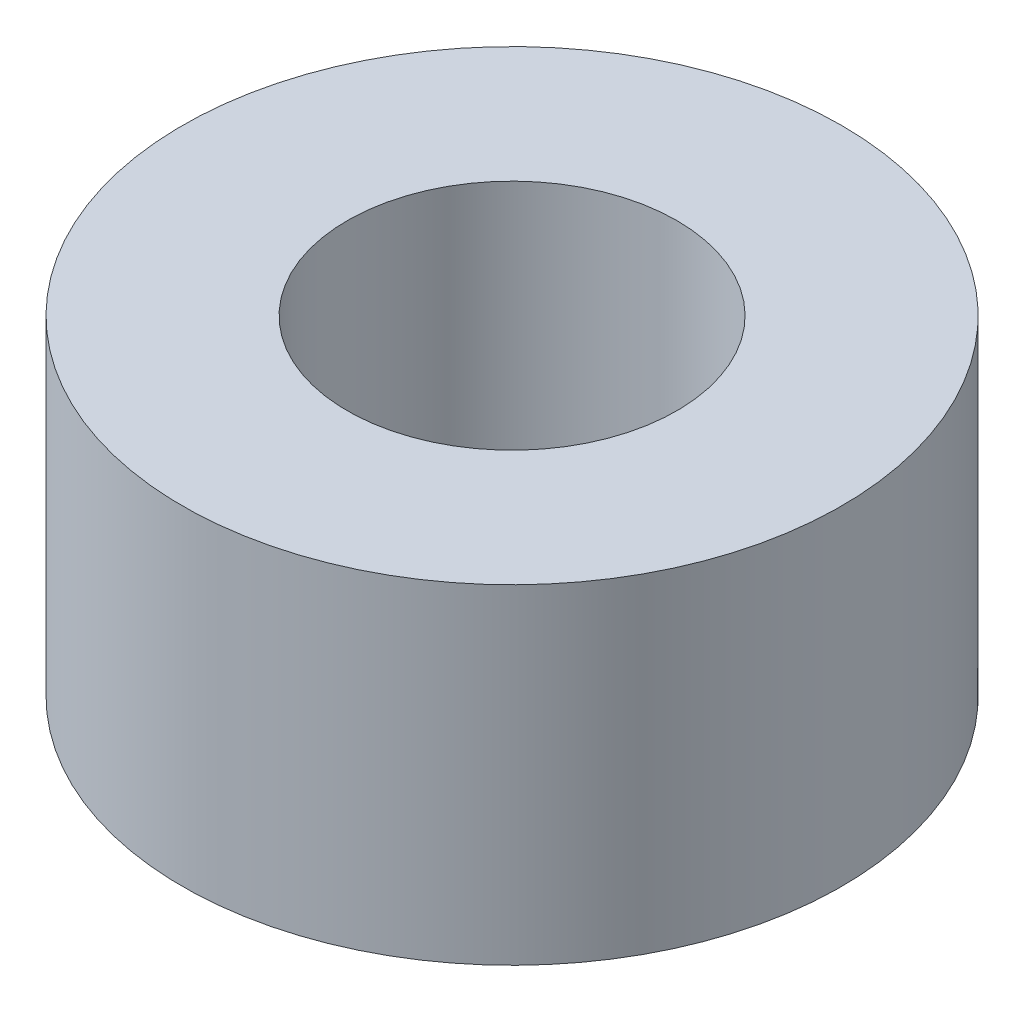
ISO-10303-21;
HEADER;
FILE_DESCRIPTION(('STEP AP214'),'2;1');
FILE_NAME('part.step','',(''),(''),'','','');
FILE_SCHEMA(('AUTOMOTIVE_DESIGN { 1 0 10303 214 1 1 1 1 }'));
ENDSEC;
DATA;
#1=APPLICATION_CONTEXT('core data for automotive mechanical design processes');
#2=APPLICATION_PROTOCOL_DEFINITION('international standard','automotive_design',2000,#1);
#3=PRODUCT_CONTEXT('',#1,'mechanical');
#4=PRODUCT('Part','Part','',(#3));
#5=PRODUCT_RELATED_PRODUCT_CATEGORY('part','',(#4));
#6=PRODUCT_DEFINITION_FORMATION('','',#4);
#7=PRODUCT_DEFINITION_CONTEXT('part definition',#1,'design');
#8=PRODUCT_DEFINITION('design','',#6,#7);
#9=PRODUCT_DEFINITION_SHAPE('','',#8);
#10=(LENGTH_UNIT() NAMED_UNIT(*) SI_UNIT(.MILLI.,.METRE.));
#11=(NAMED_UNIT(*) PLANE_ANGLE_UNIT() SI_UNIT($,.RADIAN.));
#12=(NAMED_UNIT(*) SI_UNIT($,.STERADIAN.) SOLID_ANGLE_UNIT());
#13=UNCERTAINTY_MEASURE_WITH_UNIT(LENGTH_MEASURE(1.E-05),#10,'distance_accuracy_value','');
#14=(GEOMETRIC_REPRESENTATION_CONTEXT(3) GLOBAL_UNCERTAINTY_ASSIGNED_CONTEXT((#13)) GLOBAL_UNIT_ASSIGNED_CONTEXT((#10,
#11,#12)) REPRESENTATION_CONTEXT('',''));
#15=CARTESIAN_POINT('',(0.,0.,0.));
#16=DIRECTION('',(0.,0.,1.));
#17=DIRECTION('',(1.,0.,0.));
#18=AXIS2_PLACEMENT_3D('',#15,#16,#17);
#19=CARTESIAN_POINT('',(0.,9.525,0.));
#20=DIRECTION('',(0.,1.,0.));
#21=DIRECTION('',(0.,0.,1.));
#22=AXIS2_PLACEMENT_3D('',#19,#20,#21);
#23=PLANE('',#22);
#24=CARTESIAN_POINT('',(0.,9.525,0.));
#25=DIRECTION('',(0.,1.,0.));
#26=DIRECTION('',(0.,0.,1.));
#27=AXIS2_PLACEMENT_3D('',#24,#25,#26);
#28=CIRCLE('',#27,9.525);
#29=CARTESIAN_POINT('',(0.,9.525,-9.525));
#30=VERTEX_POINT('',#29);
#31=EDGE_CURVE('E10',#30,#30,#28,.T.);
#32=ORIENTED_EDGE('',*,*,#31,.T.);
#33=EDGE_LOOP('',(#32));
#34=FACE_BOUND('',#33,.T.);
#35=CARTESIAN_POINT('',(0.,9.525,0.));
#36=DIRECTION('',(0.,1.,0.));
#37=DIRECTION('',(0.,0.,1.));
#38=AXIS2_PLACEMENT_3D('',#35,#36,#37);
#39=CIRCLE('',#38,4.7625);
#40=CARTESIAN_POINT('',(0.,9.525,-4.7625));
#41=VERTEX_POINT('',#40);
#42=EDGE_CURVE('E41',#41,#41,#39,.T.);
#43=ORIENTED_EDGE('',*,*,#42,.F.);
#44=EDGE_LOOP('',(#43));
#45=FACE_BOUND('',#44,.T.);
#46=ADVANCED_FACE('F30',(#34,#45),#23,.T.);
#47=CARTESIAN_POINT('',(0.,0.,0.));
#48=DIRECTION('',(0.,1.,0.));
#49=DIRECTION('',(0.,0.,1.));
#50=AXIS2_PLACEMENT_3D('',#47,#48,#49);
#51=PLANE('',#50);
#52=CARTESIAN_POINT('',(0.,0.,0.));
#53=DIRECTION('',(0.,1.,0.));
#54=DIRECTION('',(0.,0.,1.));
#55=AXIS2_PLACEMENT_3D('',#52,#53,#54);
#56=CIRCLE('',#55,9.525);
#57=CARTESIAN_POINT('',(0.,0.,-9.525));
#58=VERTEX_POINT('',#57);
#59=EDGE_CURVE('E34',#58,#58,#56,.T.);
#60=ORIENTED_EDGE('',*,*,#59,.F.);
#61=EDGE_LOOP('',(#60));
#62=FACE_BOUND('',#61,.T.);
#63=CARTESIAN_POINT('',(0.,0.,0.));
#64=DIRECTION('',(0.,1.,0.));
#65=DIRECTION('',(0.,0.,1.));
#66=AXIS2_PLACEMENT_3D('',#63,#64,#65);
#67=CIRCLE('',#66,4.7625);
#68=CARTESIAN_POINT('',(0.,0.,-4.7625));
#69=VERTEX_POINT('',#68);
#70=EDGE_CURVE('E43',#69,#69,#67,.T.);
#71=ORIENTED_EDGE('',*,*,#70,.T.);
#72=EDGE_LOOP('',(#71));
#73=FACE_BOUND('',#72,.T.);
#74=ADVANCED_FACE('F53',(#62,#73),#51,.F.);
#75=CARTESIAN_POINT('',(0.,9.525,0.));
#76=DIRECTION('',(0.,-1.,0.));
#77=DIRECTION('',(0.,0.,-1.));
#78=AXIS2_PLACEMENT_3D('',#75,#76,#77);
#79=CYLINDRICAL_SURFACE('',#78,9.525);
#80=CARTESIAN_POINT('',(0.,9.525,-9.525));
#81=CARTESIAN_POINT('',(0.,9.42578125,-9.525));
#82=CARTESIAN_POINT('',(0.,9.3265625,-9.525));
#83=CARTESIAN_POINT('',(0.,9.128125,-9.525));
#84=CARTESIAN_POINT('',(0.,9.02890625,-9.525));
#85=CARTESIAN_POINT('',(0.,8.83046875,-9.525));
#86=CARTESIAN_POINT('',(0.,8.73125,-9.525));
#87=CARTESIAN_POINT('',(0.,8.5328125,-9.525));
#88=CARTESIAN_POINT('',(0.,8.43359375,-9.525));
#89=CARTESIAN_POINT('',(0.,8.23515625,-9.525));
#90=CARTESIAN_POINT('',(0.,8.1359375,-9.525));
#91=CARTESIAN_POINT('',(0.,7.9375,-9.525));
#92=CARTESIAN_POINT('',(0.,7.83828125,-9.525));
#93=CARTESIAN_POINT('',(0.,7.63984375,-9.525));
#94=CARTESIAN_POINT('',(0.,7.540625,-9.525));
#95=CARTESIAN_POINT('',(0.,7.3421875,-9.525));
#96=CARTESIAN_POINT('',(0.,7.24296875,-9.525));
#97=CARTESIAN_POINT('',(0.,7.04453125,-9.525));
#98=CARTESIAN_POINT('',(0.,6.9453125,-9.525));
#99=CARTESIAN_POINT('',(0.,6.746875,-9.525));
#100=CARTESIAN_POINT('',(0.,6.64765625,-9.525));
#101=CARTESIAN_POINT('',(0.,6.44921875,-9.525));
#102=CARTESIAN_POINT('',(0.,6.35,-9.525));
#103=CARTESIAN_POINT('',(0.,6.1515625,-9.525));
#104=CARTESIAN_POINT('',(0.,6.05234375,-9.525));
#105=CARTESIAN_POINT('',(0.,5.85390625,-9.525));
#106=CARTESIAN_POINT('',(0.,5.7546875,-9.525));
#107=CARTESIAN_POINT('',(0.,5.55625,-9.525));
#108=CARTESIAN_POINT('',(0.,5.45703125,-9.525));
#109=CARTESIAN_POINT('',(0.,5.25859375,-9.525));
#110=CARTESIAN_POINT('',(0.,5.159375,-9.525));
#111=CARTESIAN_POINT('',(0.,4.9609375,-9.525));
#112=CARTESIAN_POINT('',(0.,4.86171875,-9.525));
#113=CARTESIAN_POINT('',(0.,4.66328125,-9.525));
#114=CARTESIAN_POINT('',(0.,4.5640625,-9.525));
#115=CARTESIAN_POINT('',(0.,4.365625,-9.525));
#116=CARTESIAN_POINT('',(0.,4.26640625,-9.525));
#117=CARTESIAN_POINT('',(0.,4.06796875,-9.525));
#118=CARTESIAN_POINT('',(0.,3.96875,-9.525));
#119=CARTESIAN_POINT('',(0.,3.7703125,-9.525));
#120=CARTESIAN_POINT('',(0.,3.67109375,-9.525));
#121=CARTESIAN_POINT('',(0.,3.47265625,-9.525));
#122=CARTESIAN_POINT('',(0.,3.3734375,-9.525));
#123=CARTESIAN_POINT('',(0.,3.175,-9.525));
#124=CARTESIAN_POINT('',(0.,3.07578125,-9.525));
#125=CARTESIAN_POINT('',(0.,2.87734375,-9.525));
#126=CARTESIAN_POINT('',(0.,2.778125,-9.525));
#127=CARTESIAN_POINT('',(0.,2.5796875,-9.525));
#128=CARTESIAN_POINT('',(0.,2.48046875,-9.525));
#129=CARTESIAN_POINT('',(0.,2.28203125,-9.525));
#130=CARTESIAN_POINT('',(0.,2.1828125,-9.525));
#131=CARTESIAN_POINT('',(0.,1.984375,-9.525));
#132=CARTESIAN_POINT('',(0.,1.88515625,-9.525));
#133=CARTESIAN_POINT('',(0.,1.68671875,-9.525));
#134=CARTESIAN_POINT('',(0.,1.5875,-9.525));
#135=CARTESIAN_POINT('',(0.,1.3890625,-9.525));
#136=CARTESIAN_POINT('',(0.,1.28984375,-9.525));
#137=CARTESIAN_POINT('',(0.,1.09140625,-9.525));
#138=CARTESIAN_POINT('',(0.,0.992187500000001,-9.525));
#139=CARTESIAN_POINT('',(0.,0.793750000000001,-9.525));
#140=CARTESIAN_POINT('',(0.,0.69453125,-9.525));
#141=CARTESIAN_POINT('',(0.,0.49609375,-9.525));
#142=CARTESIAN_POINT('',(0.,0.396875,-9.525));
#143=CARTESIAN_POINT('',(0.,0.1984375,-9.525));
#144=CARTESIAN_POINT('',(0.,0.0992187500000001,-9.525));
#145=CARTESIAN_POINT('',(0.,0.,-9.525));
#146=B_SPLINE_CURVE_WITH_KNOTS('',3,(#80,#81,#82,#83,#84,#85,#86,#87,#88,#89,#90,#91,#92,#93,
#94,#95,#96,#97,#98,#99,#100,#101,#102,#103,#104,#105,#106,#107,#108,#109,#110,#111,#112,#113,
#114,#115,#116,#117,#118,#119,#120,#121,#122,#123,#124,#125,#126,#127,#128,#129,#130,#131,#132,
#133,#134,#135,#136,#137,#138,#139,#140,#141,#142,#143,#144,#145),.UNSPECIFIED.,.F.,.F.,(4,2,2,
2,2,2,2,2,2,2,2,2,2,2,2,2,2,2,2,2,2,2,2,2,2,2,2,2,2,2,2,2,4),(0.,0.29765625,0.5953125,
0.892968750000001,1.190625,1.48828125,1.7859375,2.08359375,2.38125,2.67890625,2.9765625,
3.27421875,3.571875,3.86953125,4.1671875,4.46484375,4.7625,5.06015625,5.3578125,5.65546875,
5.953125,6.25078125,6.5484375,6.84609375,7.14375,7.44140625,7.7390625,8.03671875,8.334375,
8.63203125,8.9296875,9.22734375,9.525),.UNSPECIFIED.);
#147=EDGE_CURVE('BSEAM32',#30,#58,#146,.T.);
#148=ORIENTED_EDGE('',*,*,#31,.F.);
#149=ORIENTED_EDGE('',*,*,#59,.T.);
#150=ORIENTED_EDGE('',*,*,#147,.T.);
#151=ORIENTED_EDGE('',*,*,#147,.F.);
#152=EDGE_LOOP('',(#148,#150,#149,#151));
#153=FACE_BOUND('',#152,.T.);
#154=ADVANCED_FACE('F32',(#153),#79,.T.);
#155=CARTESIAN_POINT('',(0.,9.525,0.));
#156=DIRECTION('',(0.,-1.,0.));
#157=DIRECTION('',(0.,0.,-1.));
#158=AXIS2_PLACEMENT_3D('',#155,#156,#157);
#159=CYLINDRICAL_SURFACE('',#158,4.7625);
#160=CARTESIAN_POINT('',(0.,9.525,-4.7625));
#161=CARTESIAN_POINT('',(0.,9.42578125,-4.7625));
#162=CARTESIAN_POINT('',(0.,9.3265625,-4.7625));
#163=CARTESIAN_POINT('',(0.,9.128125,-4.7625));
#164=CARTESIAN_POINT('',(0.,9.02890625,-4.7625));
#165=CARTESIAN_POINT('',(0.,8.83046875,-4.7625));
#166=CARTESIAN_POINT('',(0.,8.73125,-4.7625));
#167=CARTESIAN_POINT('',(0.,8.5328125,-4.7625));
#168=CARTESIAN_POINT('',(0.,8.43359375,-4.7625));
#169=CARTESIAN_POINT('',(0.,8.23515625,-4.7625));
#170=CARTESIAN_POINT('',(0.,8.1359375,-4.7625));
#171=CARTESIAN_POINT('',(0.,7.9375,-4.7625));
#172=CARTESIAN_POINT('',(0.,7.83828125,-4.7625));
#173=CARTESIAN_POINT('',(0.,7.63984375,-4.7625));
#174=CARTESIAN_POINT('',(0.,7.540625,-4.7625));
#175=CARTESIAN_POINT('',(0.,7.3421875,-4.7625));
#176=CARTESIAN_POINT('',(0.,7.24296875,-4.7625));
#177=CARTESIAN_POINT('',(0.,7.04453125,-4.7625));
#178=CARTESIAN_POINT('',(0.,6.9453125,-4.7625));
#179=CARTESIAN_POINT('',(0.,6.746875,-4.7625));
#180=CARTESIAN_POINT('',(0.,6.64765625,-4.7625));
#181=CARTESIAN_POINT('',(0.,6.44921875,-4.7625));
#182=CARTESIAN_POINT('',(0.,6.35,-4.7625));
#183=CARTESIAN_POINT('',(0.,6.1515625,-4.7625));
#184=CARTESIAN_POINT('',(0.,6.05234375,-4.7625));
#185=CARTESIAN_POINT('',(0.,5.85390625,-4.7625));
#186=CARTESIAN_POINT('',(0.,5.7546875,-4.7625));
#187=CARTESIAN_POINT('',(0.,5.55625,-4.7625));
#188=CARTESIAN_POINT('',(0.,5.45703125,-4.7625));
#189=CARTESIAN_POINT('',(0.,5.25859375,-4.7625));
#190=CARTESIAN_POINT('',(0.,5.159375,-4.7625));
#191=CARTESIAN_POINT('',(0.,4.9609375,-4.7625));
#192=CARTESIAN_POINT('',(0.,4.86171875,-4.7625));
#193=CARTESIAN_POINT('',(0.,4.66328125,-4.7625));
#194=CARTESIAN_POINT('',(0.,4.5640625,-4.7625));
#195=CARTESIAN_POINT('',(0.,4.365625,-4.7625));
#196=CARTESIAN_POINT('',(0.,4.26640625,-4.7625));
#197=CARTESIAN_POINT('',(0.,4.06796875,-4.7625));
#198=CARTESIAN_POINT('',(0.,3.96875,-4.7625));
#199=CARTESIAN_POINT('',(0.,3.7703125,-4.7625));
#200=CARTESIAN_POINT('',(0.,3.67109375,-4.7625));
#201=CARTESIAN_POINT('',(0.,3.47265625,-4.7625));
#202=CARTESIAN_POINT('',(0.,3.3734375,-4.7625));
#203=CARTESIAN_POINT('',(0.,3.175,-4.7625));
#204=CARTESIAN_POINT('',(0.,3.07578125,-4.7625));
#205=CARTESIAN_POINT('',(0.,2.87734375,-4.7625));
#206=CARTESIAN_POINT('',(0.,2.778125,-4.7625));
#207=CARTESIAN_POINT('',(0.,2.5796875,-4.7625));
#208=CARTESIAN_POINT('',(0.,2.48046875,-4.7625));
#209=CARTESIAN_POINT('',(0.,2.28203125,-4.7625));
#210=CARTESIAN_POINT('',(0.,2.1828125,-4.7625));
#211=CARTESIAN_POINT('',(0.,1.984375,-4.7625));
#212=CARTESIAN_POINT('',(0.,1.88515625,-4.7625));
#213=CARTESIAN_POINT('',(0.,1.68671875,-4.7625));
#214=CARTESIAN_POINT('',(0.,1.5875,-4.7625));
#215=CARTESIAN_POINT('',(0.,1.3890625,-4.7625));
#216=CARTESIAN_POINT('',(0.,1.28984375,-4.7625));
#217=CARTESIAN_POINT('',(0.,1.09140625,-4.7625));
#218=CARTESIAN_POINT('',(0.,0.992187500000001,-4.7625));
#219=CARTESIAN_POINT('',(0.,0.793750000000001,-4.7625));
#220=CARTESIAN_POINT('',(0.,0.69453125,-4.7625));
#221=CARTESIAN_POINT('',(0.,0.49609375,-4.7625));
#222=CARTESIAN_POINT('',(0.,0.396875,-4.7625));
#223=CARTESIAN_POINT('',(0.,0.1984375,-4.7625));
#224=CARTESIAN_POINT('',(0.,0.0992187500000001,-4.7625));
#225=CARTESIAN_POINT('',(0.,0.,-4.7625));
#226=B_SPLINE_CURVE_WITH_KNOTS('',3,(#160,#161,#162,#163,#164,#165,#166,#167,#168,#169,#170,
#171,#172,#173,#174,#175,#176,#177,#178,#179,#180,#181,#182,#183,#184,#185,#186,#187,#188,#189,
#190,#191,#192,#193,#194,#195,#196,#197,#198,#199,#200,#201,#202,#203,#204,#205,#206,#207,#208,
#209,#210,#211,#212,#213,#214,#215,#216,#217,#218,#219,#220,#221,#222,#223,#224,#225),
.UNSPECIFIED.,.F.,.F.,(4,2,2,2,2,2,2,2,2,2,2,2,2,2,2,2,2,2,2,2,2,2,2,2,2,2,2,2,2,2,2,2,4),(0.,
0.29765625,0.5953125,0.892968750000001,1.190625,1.48828125,1.7859375,2.08359375,2.38125,
2.67890625,2.9765625,3.27421875,3.571875,3.86953125,4.1671875,4.46484375,4.7625,5.06015625,
5.3578125,5.65546875,5.953125,6.25078125,6.5484375,6.84609375,7.14375,7.44140625,7.7390625,
8.03671875,8.334375,8.63203125,8.9296875,9.22734375,9.525),.UNSPECIFIED.);
#227=EDGE_CURVE('BSEAM49',#41,#69,#226,.T.);
#228=ORIENTED_EDGE('',*,*,#42,.T.);
#229=ORIENTED_EDGE('',*,*,#70,.F.);
#230=ORIENTED_EDGE('',*,*,#227,.T.);
#231=ORIENTED_EDGE('',*,*,#227,.F.);
#232=EDGE_LOOP('',(#228,#230,#229,#231));
#233=FACE_BOUND('',#232,.T.);
#234=ADVANCED_FACE('F49',(#233),#159,.F.);
#235=CLOSED_SHELL('',(#46,#74,#154,#234));
#236=MANIFOLD_SOLID_BREP('B2',#235);
#237=ADVANCED_BREP_SHAPE_REPRESENTATION('',(#18,#236),#14);
#238=SHAPE_DEFINITION_REPRESENTATION(#9,#237);
ENDSEC;
END-ISO-10303-21;
